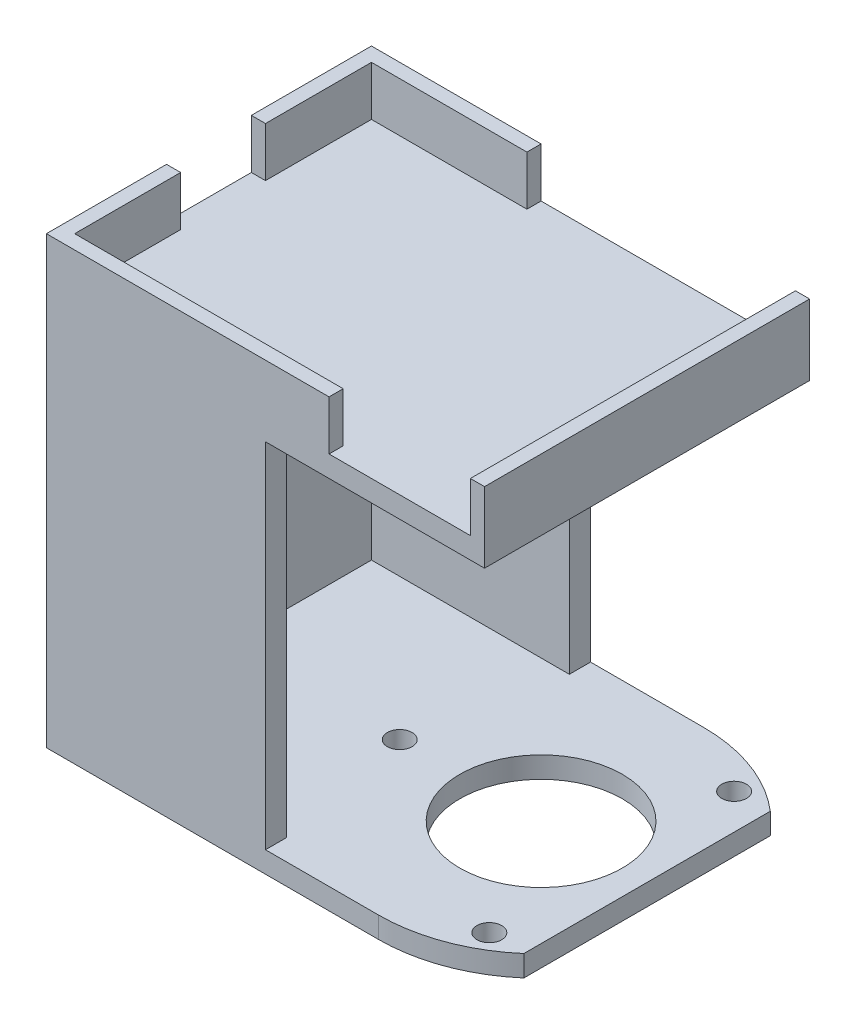
ISO-10303-21;
HEADER;
FILE_DESCRIPTION(('STEP AP214'),'2;1');
FILE_NAME('part.step','',(''),(''),'','','');
FILE_SCHEMA(('AUTOMOTIVE_DESIGN { 1 0 10303 214 1 1 1 1 }'));
ENDSEC;
DATA;
#1=APPLICATION_CONTEXT('core data for automotive mechanical design processes');
#2=APPLICATION_PROTOCOL_DEFINITION('international standard','automotive_design',2000,#1);
#3=PRODUCT_CONTEXT('',#1,'mechanical');
#4=PRODUCT('Part','Part','',(#3));
#5=PRODUCT_RELATED_PRODUCT_CATEGORY('part','',(#4));
#6=PRODUCT_DEFINITION_FORMATION('','',#4);
#7=PRODUCT_DEFINITION_CONTEXT('part definition',#1,'design');
#8=PRODUCT_DEFINITION('design','',#6,#7);
#9=PRODUCT_DEFINITION_SHAPE('','',#8);
#10=(LENGTH_UNIT() NAMED_UNIT(*) SI_UNIT(.MILLI.,.METRE.));
#11=(NAMED_UNIT(*) PLANE_ANGLE_UNIT() SI_UNIT($,.RADIAN.));
#12=(NAMED_UNIT(*) SI_UNIT($,.STERADIAN.) SOLID_ANGLE_UNIT());
#13=UNCERTAINTY_MEASURE_WITH_UNIT(LENGTH_MEASURE(1.E-05),#10,'distance_accuracy_value','');
#14=(GEOMETRIC_REPRESENTATION_CONTEXT(3) GLOBAL_UNCERTAINTY_ASSIGNED_CONTEXT((#13)) GLOBAL_UNIT_ASSIGNED_CONTEXT((#10,
#11,#12)) REPRESENTATION_CONTEXT('',''));
#15=CARTESIAN_POINT('',(0.,0.,0.));
#16=DIRECTION('',(0.,0.,1.));
#17=DIRECTION('',(1.,0.,0.));
#18=AXIS2_PLACEMENT_3D('',#15,#16,#17);
#19=CARTESIAN_POINT('',(-31.,10.,23.));
#20=DIRECTION('',(0.,0.,-1.));
#21=DIRECTION('',(-1.,0.,0.));
#22=AXIS2_PLACEMENT_3D('',#19,#20,#21);
#23=PLANE('',#22);
#24=DIRECTION('',(0.,-1.,0.));
#25=VECTOR('',#24,1.);
#26=CARTESIAN_POINT('',(16.,10.001,23.));
#27=LINE('',#26,#25);
#28=CARTESIAN_POINT('',(16.,-50.,23.));
#29=VERTEX_POINT('',#28);
#30=CARTESIAN_POINT('',(16.,-53.,23.));
#31=VERTEX_POINT('',#30);
#32=EDGE_CURVE('E506',#29,#31,#27,.T.);
#33=ORIENTED_EDGE('',*,*,#32,.F.);
#34=DIRECTION('',(-1.,0.,0.));
#35=VECTOR('',#34,1.);
#36=CARTESIAN_POINT('',(31.,-50.,23.));
#37=LINE('',#36,#35);
#38=CARTESIAN_POINT('',(0.,-50.,23.));
#39=VERTEX_POINT('',#38);
#40=EDGE_CURVE('E269',#29,#39,#37,.T.);
#41=ORIENTED_EDGE('',*,*,#40,.T.);
#42=DIRECTION('',(0.,1.,0.));
#43=VECTOR('',#42,1.);
#44=CARTESIAN_POINT('',(0.,-50.,23.));
#45=LINE('',#44,#43);
#46=CARTESIAN_POINT('',(0.,0.,23.));
#47=VERTEX_POINT('',#46);
#48=EDGE_CURVE('E330',#39,#47,#45,.T.);
#49=ORIENTED_EDGE('',*,*,#48,.T.);
#50=DIRECTION('',(1.,0.,0.));
#51=VECTOR('',#50,1.);
#52=CARTESIAN_POINT('',(-31.,0.,23.));
#53=LINE('',#52,#51);
#54=CARTESIAN_POINT('',(31.,0.,23.));
#55=VERTEX_POINT('',#54);
#56=EDGE_CURVE('E451',#47,#55,#53,.T.);
#57=ORIENTED_EDGE('',*,*,#56,.T.);
#58=DIRECTION('',(0.,-1.,0.));
#59=VECTOR('',#58,1.);
#60=CARTESIAN_POINT('',(31.,10.,23.));
#61=LINE('',#60,#59);
#62=CARTESIAN_POINT('',(31.,10.,23.));
#63=VERTEX_POINT('',#62);
#64=EDGE_CURVE('E466',#63,#55,#61,.T.);
#65=ORIENTED_EDGE('',*,*,#64,.F.);
#66=DIRECTION('',(1.,0.,0.));
#67=VECTOR('',#66,1.);
#68=CARTESIAN_POINT('',(-31.,10.,23.));
#69=LINE('',#68,#67);
#70=CARTESIAN_POINT('',(29.,10.,23.));
#71=VERTEX_POINT('',#70);
#72=EDGE_CURVE('E461',#71,#63,#69,.T.);
#73=ORIENTED_EDGE('',*,*,#72,.F.);
#74=DIRECTION('',(0.,1.,0.));
#75=VECTOR('',#74,1.);
#76=CARTESIAN_POINT('',(29.,10.,23.));
#77=LINE('',#76,#75);
#78=CARTESIAN_POINT('',(29.,3.,23.));
#79=VERTEX_POINT('',#78);
#80=EDGE_CURVE('E337',#79,#71,#77,.T.);
#81=ORIENTED_EDGE('',*,*,#80,.F.);
#82=DIRECTION('',(1.,0.,0.));
#83=VECTOR('',#82,1.);
#84=CARTESIAN_POINT('',(29.,3.,23.));
#85=LINE('',#84,#83);
#86=CARTESIAN_POINT('',(9.00000000000001,3.,23.));
#87=VERTEX_POINT('',#86);
#88=EDGE_CURVE('E349',#87,#79,#85,.T.);
#89=ORIENTED_EDGE('',*,*,#88,.F.);
#90=DIRECTION('',(0.,-1.,0.));
#91=VECTOR('',#90,1.);
#92=CARTESIAN_POINT('',(9.00000000000001,10.,23.));
#93=LINE('',#92,#91);
#94=CARTESIAN_POINT('',(9.00000000000001,10.,23.));
#95=VERTEX_POINT('',#94);
#96=EDGE_CURVE('E333',#95,#87,#93,.T.);
#97=ORIENTED_EDGE('',*,*,#96,.F.);
#98=CARTESIAN_POINT('',(-31.,10.,23.));
#99=VERTEX_POINT('',#98);
#100=EDGE_CURVE('E462',#99,#95,#69,.T.);
#101=ORIENTED_EDGE('',*,*,#100,.F.);
#102=DIRECTION('',(0.,-1.,0.));
#103=VECTOR('',#102,1.);
#104=CARTESIAN_POINT('',(-31.,10.,23.));
#105=LINE('',#104,#103);
#106=CARTESIAN_POINT('',(-31.,-53.,23.));
#107=VERTEX_POINT('',#106);
#108=EDGE_CURVE('E479',#99,#107,#105,.T.);
#109=ORIENTED_EDGE('',*,*,#108,.T.);
#110=DIRECTION('',(-1.,0.,0.));
#111=VECTOR('',#110,1.);
#112=CARTESIAN_POINT('',(31.,-53.,23.));
#113=LINE('',#112,#111);
#114=EDGE_CURVE('E266',#31,#107,#113,.T.);
#115=ORIENTED_EDGE('',*,*,#114,.F.);
#116=EDGE_LOOP('',(#33,#41,#49,#57,#65,#73,#81,#89,#97,#101,#109,#115));
#117=FACE_BOUND('',#116,.T.);
#118=ADVANCED_FACE('F63',(#117),#23,.F.);
#119=CARTESIAN_POINT('',(31.,-53.,-23.));
#120=DIRECTION('',(-1.,0.,0.));
#121=DIRECTION('',(0.,0.,1.));
#122=AXIS2_PLACEMENT_3D('',#119,#120,#121);
#123=PLANE('',#122);
#124=DIRECTION('',(0.,-1.,0.));
#125=VECTOR('',#124,1.);
#126=CARTESIAN_POINT('',(31.,10.001,-17.4355957741627));
#127=LINE('',#126,#125);
#128=CARTESIAN_POINT('',(31.,-50.,-17.4355957741627));
#129=VERTEX_POINT('',#128);
#130=CARTESIAN_POINT('',(31.,-53.,-17.4355957741627));
#131=VERTEX_POINT('',#130);
#132=EDGE_CURVE('E238',#129,#131,#127,.T.);
#133=ORIENTED_EDGE('',*,*,#132,.F.);
#134=DIRECTION('',(0.,0.,1.));
#135=VECTOR('',#134,1.);
#136=CARTESIAN_POINT('',(31.,-50.,-23.));
#137=LINE('',#136,#135);
#138=CARTESIAN_POINT('',(31.,-50.,17.4355957741627));
#139=VERTEX_POINT('',#138);
#140=EDGE_CURVE('E278',#129,#139,#137,.T.);
#141=ORIENTED_EDGE('',*,*,#140,.T.);
#142=DIRECTION('',(0.,-1.,0.));
#143=VECTOR('',#142,1.);
#144=CARTESIAN_POINT('',(31.,10.001,17.4355957741627));
#145=LINE('',#144,#143);
#146=CARTESIAN_POINT('',(31.,-53.,17.4355957741627));
#147=VERTEX_POINT('',#146);
#148=EDGE_CURVE('E87',#139,#147,#145,.T.);
#149=ORIENTED_EDGE('',*,*,#148,.T.);
#150=DIRECTION('',(0.,0.,1.));
#151=VECTOR('',#150,1.);
#152=CARTESIAN_POINT('',(31.,-53.,-23.));
#153=LINE('',#152,#151);
#154=EDGE_CURVE('E261',#131,#147,#153,.T.);
#155=ORIENTED_EDGE('',*,*,#154,.F.);
#156=EDGE_LOOP('',(#133,#141,#149,#155));
#157=FACE_BOUND('',#156,.T.);
#158=ADVANCED_FACE('F541',(#157),#123,.F.);
#159=CARTESIAN_POINT('',(0.,-53.,0.));
#160=DIRECTION('',(0.,-1.,0.));
#161=DIRECTION('',(0.,0.,-1.));
#162=AXIS2_PLACEMENT_3D('',#159,#160,#161);
#163=PLANE('',#162);
#164=CARTESIAN_POINT('',(-3.99999999999997,-53.,0.));
#165=DIRECTION('',(0.,-1.,0.));
#166=DIRECTION('',(0.,0.,-1.));
#167=AXIS2_PLACEMENT_3D('',#164,#165,#166);
#168=CIRCLE('',#167,1.75);
#169=CARTESIAN_POINT('',(-3.99999999999997,-53.,-1.75));
#170=VERTEX_POINT('',#169);
#171=EDGE_CURVE('E525',#170,#170,#168,.T.);
#172=ORIENTED_EDGE('',*,*,#171,.F.);
#173=EDGE_LOOP('',(#172));
#174=FACE_BOUND('',#173,.T.);
#175=CARTESIAN_POINT('',(16.,-53.,0.));
#176=DIRECTION('',(0.,-1.,0.));
#177=DIRECTION('',(0.,0.,-1.));
#178=AXIS2_PLACEMENT_3D('',#175,#176,#177);
#179=CIRCLE('',#178,11.5);
#180=CARTESIAN_POINT('',(16.,-53.,-11.5));
#181=VERTEX_POINT('',#180);
#182=EDGE_CURVE('E517',#181,#181,#179,.T.);
#183=ORIENTED_EDGE('',*,*,#182,.F.);
#184=EDGE_LOOP('',(#183));
#185=FACE_BOUND('',#184,.T.);
#186=CARTESIAN_POINT('',(26.,-53.,17.3205080756888));
#187=DIRECTION('',(0.,-1.,0.));
#188=DIRECTION('',(0.,0.,-1.));
#189=AXIS2_PLACEMENT_3D('',#186,#187,#188);
#190=CIRCLE('',#189,1.75);
#191=CARTESIAN_POINT('',(26.,-53.,15.5705080756888));
#192=VERTEX_POINT('',#191);
#193=EDGE_CURVE('E508',#192,#192,#190,.T.);
#194=ORIENTED_EDGE('',*,*,#193,.F.);
#195=EDGE_LOOP('',(#194));
#196=FACE_BOUND('',#195,.T.);
#197=CARTESIAN_POINT('',(26.,-53.,-17.3205080756888));
#198=DIRECTION('',(0.,-1.,0.));
#199=DIRECTION('',(0.,0.,-1.));
#200=AXIS2_PLACEMENT_3D('',#197,#198,#199);
#201=CIRCLE('',#200,1.75);
#202=CARTESIAN_POINT('',(26.,-53.,-19.0705080756888));
#203=VERTEX_POINT('',#202);
#204=EDGE_CURVE('E501',#203,#203,#201,.T.);
#205=ORIENTED_EDGE('',*,*,#204,.F.);
#206=EDGE_LOOP('',(#205));
#207=FACE_BOUND('',#206,.T.);
#208=DIRECTION('',(1.,0.,0.));
#209=VECTOR('',#208,1.);
#210=CARTESIAN_POINT('',(31.,-53.,-23.));
#211=LINE('',#210,#209);
#212=CARTESIAN_POINT('',(-31.,-53.,-23.));
#213=VERTEX_POINT('',#212);
#214=CARTESIAN_POINT('',(16.,-53.,-23.));
#215=VERTEX_POINT('',#214);
#216=EDGE_CURVE('E251',#213,#215,#211,.T.);
#217=ORIENTED_EDGE('',*,*,#216,.T.);
#218=CARTESIAN_POINT('',(16.,-53.,0.));
#219=DIRECTION('',(0.,-1.,0.));
#220=DIRECTION('',(0.,0.,-1.));
#221=AXIS2_PLACEMENT_3D('',#218,#219,#220);
#222=CIRCLE('',#221,23.);
#223=EDGE_CURVE('E235',#215,#131,#222,.T.);
#224=ORIENTED_EDGE('',*,*,#223,.T.);
#225=ORIENTED_EDGE('',*,*,#154,.T.);
#226=CARTESIAN_POINT('',(16.,-53.,0.));
#227=DIRECTION('',(0.,-1.,0.));
#228=DIRECTION('',(0.,0.,-1.));
#229=AXIS2_PLACEMENT_3D('',#226,#227,#228);
#230=CIRCLE('',#229,23.);
#231=EDGE_CURVE('E279',#147,#31,#230,.T.);
#232=ORIENTED_EDGE('',*,*,#231,.T.);
#233=ORIENTED_EDGE('',*,*,#114,.T.);
#234=DIRECTION('',(0.,0.,-1.));
#235=VECTOR('',#234,1.);
#236=CARTESIAN_POINT('',(-31.,-53.,-23.));
#237=LINE('',#236,#235);
#238=EDGE_CURVE('E259',#107,#213,#237,.T.);
#239=ORIENTED_EDGE('',*,*,#238,.T.);
#240=EDGE_LOOP('',(#217,#224,#225,#232,#233,#239));
#241=FACE_BOUND('',#240,.T.);
#242=ADVANCED_FACE('F257',(#174,#185,#196,#207,#241),#163,.T.);
#243=CARTESIAN_POINT('',(0.,-50.,0.));
#244=DIRECTION('',(0.,-1.,0.));
#245=DIRECTION('',(0.,0.,-1.));
#246=AXIS2_PLACEMENT_3D('',#243,#244,#245);
#247=PLANE('',#246);
#248=CARTESIAN_POINT('',(-3.99999999999997,-50.,0.));
#249=DIRECTION('',(0.,-1.,0.));
#250=DIRECTION('',(0.,0.,-1.));
#251=AXIS2_PLACEMENT_3D('',#248,#249,#250);
#252=CIRCLE('',#251,1.75);
#253=CARTESIAN_POINT('',(-3.99999999999997,-50.,-1.75));
#254=VERTEX_POINT('',#253);
#255=EDGE_CURVE('E521',#254,#254,#252,.F.);
#256=ORIENTED_EDGE('',*,*,#255,.F.);
#257=EDGE_LOOP('',(#256));
#258=FACE_BOUND('',#257,.T.);
#259=CARTESIAN_POINT('',(16.,-50.,0.));
#260=DIRECTION('',(0.,-1.,0.));
#261=DIRECTION('',(0.,0.,-1.));
#262=AXIS2_PLACEMENT_3D('',#259,#260,#261);
#263=CIRCLE('',#262,11.5);
#264=CARTESIAN_POINT('',(16.,-50.,-11.5));
#265=VERTEX_POINT('',#264);
#266=EDGE_CURVE('E513',#265,#265,#263,.F.);
#267=ORIENTED_EDGE('',*,*,#266,.F.);
#268=EDGE_LOOP('',(#267));
#269=FACE_BOUND('',#268,.T.);
#270=CARTESIAN_POINT('',(26.,-50.,17.3205080756888));
#271=DIRECTION('',(0.,-1.,0.));
#272=DIRECTION('',(0.,0.,-1.));
#273=AXIS2_PLACEMENT_3D('',#270,#271,#272);
#274=CIRCLE('',#273,1.75);
#275=CARTESIAN_POINT('',(26.,-50.,15.5705080756888));
#276=VERTEX_POINT('',#275);
#277=EDGE_CURVE('E512',#276,#276,#274,.F.);
#278=ORIENTED_EDGE('',*,*,#277,.F.);
#279=EDGE_LOOP('',(#278));
#280=FACE_BOUND('',#279,.T.);
#281=CARTESIAN_POINT('',(26.,-50.,-17.3205080756888));
#282=DIRECTION('',(0.,-1.,0.));
#283=DIRECTION('',(0.,0.,-1.));
#284=AXIS2_PLACEMENT_3D('',#281,#282,#283);
#285=CIRCLE('',#284,1.75);
#286=CARTESIAN_POINT('',(26.,-50.,-19.0705080756888));
#287=VERTEX_POINT('',#286);
#288=EDGE_CURVE('E495',#287,#287,#285,.F.);
#289=ORIENTED_EDGE('',*,*,#288,.F.);
#290=EDGE_LOOP('',(#289));
#291=FACE_BOUND('',#290,.T.);
#292=CARTESIAN_POINT('',(16.,-50.,0.));
#293=DIRECTION('',(0.,-1.,0.));
#294=DIRECTION('',(0.,0.,-1.));
#295=AXIS2_PLACEMENT_3D('',#292,#293,#294);
#296=CIRCLE('',#295,23.);
#297=CARTESIAN_POINT('',(16.,-50.,-23.));
#298=VERTEX_POINT('',#297);
#299=EDGE_CURVE('E244',#129,#298,#296,.F.);
#300=ORIENTED_EDGE('',*,*,#299,.T.);
#301=DIRECTION('',(1.,0.,0.));
#302=VECTOR('',#301,1.);
#303=CARTESIAN_POINT('',(31.,-50.,-23.));
#304=LINE('',#303,#302);
#305=CARTESIAN_POINT('',(0.,-50.,-23.));
#306=VERTEX_POINT('',#305);
#307=EDGE_CURVE('E254',#306,#298,#304,.T.);
#308=ORIENTED_EDGE('',*,*,#307,.F.);
#309=DIRECTION('',(0.,0.,-1.));
#310=VECTOR('',#309,1.);
#311=CARTESIAN_POINT('',(0.,-50.,0.));
#312=LINE('',#311,#310);
#313=CARTESIAN_POINT('',(0.,-50.,-20.));
#314=VERTEX_POINT('',#313);
#315=EDGE_CURVE('E289',#314,#306,#312,.T.);
#316=ORIENTED_EDGE('',*,*,#315,.F.);
#317=DIRECTION('',(-1.,0.,0.));
#318=VECTOR('',#317,1.);
#319=CARTESIAN_POINT('',(0.,-50.,-20.));
#320=LINE('',#319,#318);
#321=CARTESIAN_POINT('',(-28.,-50.,-20.));
#322=VERTEX_POINT('',#321);
#323=EDGE_CURVE('E291',#314,#322,#320,.T.);
#324=ORIENTED_EDGE('',*,*,#323,.T.);
#325=DIRECTION('',(0.,0.,1.));
#326=VECTOR('',#325,1.);
#327=CARTESIAN_POINT('',(-28.,-50.,0.));
#328=LINE('',#327,#326);
#329=CARTESIAN_POINT('',(-28.,-50.,20.));
#330=VERTEX_POINT('',#329);
#331=EDGE_CURVE('E294',#322,#330,#328,.T.);
#332=ORIENTED_EDGE('',*,*,#331,.T.);
#333=DIRECTION('',(-1.,0.,0.));
#334=VECTOR('',#333,1.);
#335=CARTESIAN_POINT('',(0.,-50.,20.));
#336=LINE('',#335,#334);
#337=CARTESIAN_POINT('',(0.,-50.,20.));
#338=VERTEX_POINT('',#337);
#339=EDGE_CURVE('E297',#338,#330,#336,.T.);
#340=ORIENTED_EDGE('',*,*,#339,.F.);
#341=EDGE_CURVE('E285',#39,#338,#312,.T.);
#342=ORIENTED_EDGE('',*,*,#341,.F.);
#343=ORIENTED_EDGE('',*,*,#40,.F.);
#344=CARTESIAN_POINT('',(16.,-50.,0.));
#345=DIRECTION('',(0.,-1.,0.));
#346=DIRECTION('',(0.,0.,-1.));
#347=AXIS2_PLACEMENT_3D('',#344,#345,#346);
#348=CIRCLE('',#347,23.);
#349=EDGE_CURVE('E535',#29,#139,#348,.F.);
#350=ORIENTED_EDGE('',*,*,#349,.T.);
#351=ORIENTED_EDGE('',*,*,#140,.F.);
#352=EDGE_LOOP('',(#300,#308,#316,#324,#332,#340,#342,#343,#350,#351));
#353=FACE_BOUND('',#352,.T.);
#354=ADVANCED_FACE('F561',(#258,#269,#280,#291,#353),#247,.F.);
#355=CARTESIAN_POINT('',(0.,10.,0.));
#356=DIRECTION('',(0.,1.,0.));
#357=DIRECTION('',(0.,0.,1.));
#358=AXIS2_PLACEMENT_3D('',#355,#356,#357);
#359=PLANE('',#358);
#360=DIRECTION('',(0.,0.,-1.));
#361=VECTOR('',#360,1.);
#362=CARTESIAN_POINT('',(29.,10.,-21.));
#363=LINE('',#362,#361);
#364=CARTESIAN_POINT('',(29.,10.,-23.));
#365=VERTEX_POINT('',#364);
#366=EDGE_CURVE('E407',#71,#365,#363,.T.);
#367=ORIENTED_EDGE('',*,*,#366,.F.);
#368=ORIENTED_EDGE('',*,*,#72,.T.);
#369=DIRECTION('',(0.,0.,-1.));
#370=VECTOR('',#369,1.);
#371=CARTESIAN_POINT('',(31.,10.,-23.));
#372=LINE('',#371,#370);
#373=CARTESIAN_POINT('',(31.,10.,-23.));
#374=VERTEX_POINT('',#373);
#375=EDGE_CURVE('E446',#63,#374,#372,.T.);
#376=ORIENTED_EDGE('',*,*,#375,.T.);
#377=DIRECTION('',(-1.,0.,0.));
#378=VECTOR('',#377,1.);
#379=CARTESIAN_POINT('',(-31.,10.,-23.));
#380=LINE('',#379,#378);
#381=EDGE_CURVE('E452',#374,#365,#380,.T.);
#382=ORIENTED_EDGE('',*,*,#381,.T.);
#383=EDGE_LOOP('',(#367,#368,#376,#382));
#384=FACE_BOUND('',#383,.T.);
#385=ADVANCED_FACE('F577',(#384),#359,.T.);
#386=DIRECTION('',(0.,0.,-1.));
#387=VECTOR('',#386,1.);
#388=CARTESIAN_POINT('',(9.00000000000001,10.,23.001));
#389=LINE('',#388,#387);
#390=CARTESIAN_POINT('',(9.00000000000001,10.,21.));
#391=VERTEX_POINT('',#390);
#392=EDGE_CURVE('E345',#95,#391,#389,.T.);
#393=ORIENTED_EDGE('',*,*,#392,.T.);
#394=DIRECTION('',(1.,0.,0.));
#395=VECTOR('',#394,1.);
#396=CARTESIAN_POINT('',(-29.,10.,21.));
#397=LINE('',#396,#395);
#398=CARTESIAN_POINT('',(-29.,10.,21.));
#399=VERTEX_POINT('',#398);
#400=EDGE_CURVE('E412',#399,#391,#397,.T.);
#401=ORIENTED_EDGE('',*,*,#400,.F.);
#402=DIRECTION('',(0.,0.,1.));
#403=VECTOR('',#402,1.);
#404=CARTESIAN_POINT('',(-29.,10.,-21.));
#405=LINE('',#404,#403);
#406=CARTESIAN_POINT('',(-29.,10.,6.00000000000001));
#407=VERTEX_POINT('',#406);
#408=EDGE_CURVE('E430',#407,#399,#405,.T.);
#409=ORIENTED_EDGE('',*,*,#408,.F.);
#410=DIRECTION('',(-1.,0.,0.));
#411=VECTOR('',#410,1.);
#412=CARTESIAN_POINT('',(31.001,10.,5.99999999999999));
#413=LINE('',#412,#411);
#414=CARTESIAN_POINT('',(-31.,10.,6.00000000000001));
#415=VERTEX_POINT('',#414);
#416=EDGE_CURVE('E380',#407,#415,#413,.T.);
#417=ORIENTED_EDGE('',*,*,#416,.T.);
#418=DIRECTION('',(0.,0.,1.));
#419=VECTOR('',#418,1.);
#420=CARTESIAN_POINT('',(-31.,10.,-23.));
#421=LINE('',#420,#419);
#422=EDGE_CURVE('E456',#415,#99,#421,.T.);
#423=ORIENTED_EDGE('',*,*,#422,.T.);
#424=ORIENTED_EDGE('',*,*,#100,.T.);
#425=EDGE_LOOP('',(#393,#401,#409,#417,#423,#424));
#426=FACE_BOUND('',#425,.T.);
#427=ADVANCED_FACE('F587',(#426),#359,.T.);
#428=CARTESIAN_POINT('',(-29.,3.,-21.));
#429=DIRECTION('',(-1.,0.,0.));
#430=DIRECTION('',(0.,0.,1.));
#431=AXIS2_PLACEMENT_3D('',#428,#429,#430);
#432=PLANE('',#431);
#433=CARTESIAN_POINT('',(-29.,10.,-21.));
#434=VERTEX_POINT('',#433);
#435=CARTESIAN_POINT('',(-29.,10.,-5.99999999999999));
#436=VERTEX_POINT('',#435);
#437=EDGE_CURVE('E431',#434,#436,#405,.T.);
#438=ORIENTED_EDGE('',*,*,#437,.T.);
#439=DIRECTION('',(0.,1.,0.));
#440=VECTOR('',#439,1.);
#441=CARTESIAN_POINT('',(-29.,17.,-5.99999999999999));
#442=LINE('',#441,#440);
#443=CARTESIAN_POINT('',(-29.,3.,-5.99999999999999));
#444=VERTEX_POINT('',#443);
#445=EDGE_CURVE('E402',#444,#436,#442,.T.);
#446=ORIENTED_EDGE('',*,*,#445,.F.);
#447=DIRECTION('',(0.,0.,1.));
#448=VECTOR('',#447,1.);
#449=CARTESIAN_POINT('',(-29.,3.,-21.));
#450=LINE('',#449,#448);
#451=CARTESIAN_POINT('',(-29.,3.,-21.));
#452=VERTEX_POINT('',#451);
#453=EDGE_CURVE('E416',#452,#444,#450,.T.);
#454=ORIENTED_EDGE('',*,*,#453,.F.);
#455=DIRECTION('',(0.,1.,0.));
#456=VECTOR('',#455,1.);
#457=CARTESIAN_POINT('',(-29.,3.,-21.));
#458=LINE('',#457,#456);
#459=EDGE_CURVE('E424',#452,#434,#458,.T.);
#460=ORIENTED_EDGE('',*,*,#459,.T.);
#461=EDGE_LOOP('',(#438,#446,#454,#460));
#462=FACE_BOUND('',#461,.T.);
#463=ADVANCED_FACE('F582',(#462),#432,.F.);
#464=CARTESIAN_POINT('',(31.,10.,-23.));
#465=DIRECTION('',(-1.,0.,0.));
#466=DIRECTION('',(0.,0.,1.));
#467=AXIS2_PLACEMENT_3D('',#464,#465,#466);
#468=PLANE('',#467);
#469=DIRECTION('',(0.,0.,-1.));
#470=VECTOR('',#469,1.);
#471=CARTESIAN_POINT('',(31.,0.,-23.));
#472=LINE('',#471,#470);
#473=CARTESIAN_POINT('',(31.,0.,-23.));
#474=VERTEX_POINT('',#473);
#475=EDGE_CURVE('E442',#55,#474,#472,.T.);
#476=ORIENTED_EDGE('',*,*,#475,.T.);
#477=DIRECTION('',(0.,-1.,0.));
#478=VECTOR('',#477,1.);
#479=CARTESIAN_POINT('',(31.,10.,-23.));
#480=LINE('',#479,#478);
#481=EDGE_CURVE('E12',#374,#474,#480,.T.);
#482=ORIENTED_EDGE('',*,*,#481,.F.);
#483=ORIENTED_EDGE('',*,*,#375,.F.);
#484=ORIENTED_EDGE('',*,*,#64,.T.);
#485=EDGE_LOOP('',(#476,#482,#483,#484));
#486=FACE_BOUND('',#485,.T.);
#487=ADVANCED_FACE('F65',(#486),#468,.F.);
#488=CARTESIAN_POINT('',(-31.,10.,-23.));
#489=DIRECTION('',(0.,0.,1.));
#490=DIRECTION('',(1.,0.,0.));
#491=AXIS2_PLACEMENT_3D('',#488,#489,#490);
#492=PLANE('',#491);
#493=ORIENTED_EDGE('',*,*,#307,.T.);
#494=DIRECTION('',(0.,-1.,0.));
#495=VECTOR('',#494,1.);
#496=CARTESIAN_POINT('',(16.,10.001,-23.));
#497=LINE('',#496,#495);
#498=EDGE_CURVE('E79',#298,#215,#497,.T.);
#499=ORIENTED_EDGE('',*,*,#498,.T.);
#500=ORIENTED_EDGE('',*,*,#216,.F.);
#501=DIRECTION('',(0.,-1.,0.));
#502=VECTOR('',#501,1.);
#503=CARTESIAN_POINT('',(-31.,10.,-23.));
#504=LINE('',#503,#502);
#505=CARTESIAN_POINT('',(-31.,10.,-23.));
#506=VERTEX_POINT('',#505);
#507=EDGE_CURVE('E72',#506,#213,#504,.T.);
#508=ORIENTED_EDGE('',*,*,#507,.F.);
#509=CARTESIAN_POINT('',(-7.,9.99999999999999,-23.));
#510=VERTEX_POINT('',#509);
#511=EDGE_CURVE('E450',#510,#506,#380,.T.);
#512=ORIENTED_EDGE('',*,*,#511,.F.);
#513=DIRECTION('',(0.,1.,0.));
#514=VECTOR('',#513,1.);
#515=CARTESIAN_POINT('',(-7.,9.99999999999999,-23.));
#516=LINE('',#515,#514);
#517=CARTESIAN_POINT('',(-7.,3.,-23.));
#518=VERTEX_POINT('',#517);
#519=EDGE_CURVE('E355',#518,#510,#516,.T.);
#520=ORIENTED_EDGE('',*,*,#519,.F.);
#521=DIRECTION('',(-1.,0.,0.));
#522=VECTOR('',#521,1.);
#523=CARTESIAN_POINT('',(29.,3.,-23.));
#524=LINE('',#523,#522);
#525=CARTESIAN_POINT('',(29.,3.,-23.));
#526=VERTEX_POINT('',#525);
#527=EDGE_CURVE('E358',#526,#518,#524,.T.);
#528=ORIENTED_EDGE('',*,*,#527,.F.);
#529=DIRECTION('',(0.,-1.,0.));
#530=VECTOR('',#529,1.);
#531=CARTESIAN_POINT('',(29.,10.,-23.));
#532=LINE('',#531,#530);
#533=EDGE_CURVE('E362',#365,#526,#532,.T.);
#534=ORIENTED_EDGE('',*,*,#533,.F.);
#535=ORIENTED_EDGE('',*,*,#381,.F.);
#536=ORIENTED_EDGE('',*,*,#481,.T.);
#537=DIRECTION('',(-1.,0.,0.));
#538=VECTOR('',#537,1.);
#539=CARTESIAN_POINT('',(-31.,0.,-23.));
#540=LINE('',#539,#538);
#541=CARTESIAN_POINT('',(0.,0.,-23.));
#542=VERTEX_POINT('',#541);
#543=EDGE_CURVE('E470',#474,#542,#540,.T.);
#544=ORIENTED_EDGE('',*,*,#543,.T.);
#545=DIRECTION('',(0.,1.,0.));
#546=VECTOR('',#545,1.);
#547=CARTESIAN_POINT('',(0.,-50.,-23.));
#548=LINE('',#547,#546);
#549=EDGE_CURVE('E327',#306,#542,#548,.T.);
#550=ORIENTED_EDGE('',*,*,#549,.F.);
#551=EDGE_LOOP('',(#493,#499,#500,#508,#512,#520,#528,#534,#535,#536,#544,#550));
#552=FACE_BOUND('',#551,.T.);
#553=ADVANCED_FACE('F249',(#552),#492,.F.);
#554=CARTESIAN_POINT('',(-31.,10.,-23.));
#555=DIRECTION('',(1.,0.,0.));
#556=DIRECTION('',(0.,0.,-1.));
#557=AXIS2_PLACEMENT_3D('',#554,#555,#556);
#558=PLANE('',#557);
#559=DIRECTION('',(0.,0.,1.));
#560=VECTOR('',#559,1.);
#561=CARTESIAN_POINT('',(-31.,3.,-5.99999999999999));
#562=LINE('',#561,#560);
#563=CARTESIAN_POINT('',(-31.,3.,-5.99999999999999));
#564=VERTEX_POINT('',#563);
#565=CARTESIAN_POINT('',(-31.,3.,6.00000000000001));
#566=VERTEX_POINT('',#565);
#567=EDGE_CURVE('E391',#564,#566,#562,.T.);
#568=ORIENTED_EDGE('',*,*,#567,.F.);
#569=DIRECTION('',(0.,-1.,0.));
#570=VECTOR('',#569,1.);
#571=CARTESIAN_POINT('',(-31.,17.,-5.99999999999999));
#572=LINE('',#571,#570);
#573=CARTESIAN_POINT('',(-31.,10.,-5.99999999999999));
#574=VERTEX_POINT('',#573);
#575=EDGE_CURVE('E387',#574,#564,#572,.T.);
#576=ORIENTED_EDGE('',*,*,#575,.F.);
#577=EDGE_CURVE('E457',#506,#574,#421,.T.);
#578=ORIENTED_EDGE('',*,*,#577,.F.);
#579=ORIENTED_EDGE('',*,*,#507,.T.);
#580=ORIENTED_EDGE('',*,*,#238,.F.);
#581=ORIENTED_EDGE('',*,*,#108,.F.);
#582=ORIENTED_EDGE('',*,*,#422,.F.);
#583=DIRECTION('',(0.,1.,0.));
#584=VECTOR('',#583,1.);
#585=CARTESIAN_POINT('',(-31.,17.,6.00000000000001));
#586=LINE('',#585,#584);
#587=EDGE_CURVE('E395',#566,#415,#586,.T.);
#588=ORIENTED_EDGE('',*,*,#587,.F.);
#589=EDGE_LOOP('',(#568,#576,#578,#579,#580,#581,#582,#588));
#590=FACE_BOUND('',#589,.T.);
#591=ADVANCED_FACE('F486',(#590),#558,.F.);
#592=DIRECTION('',(0.,0.,1.));
#593=VECTOR('',#592,1.);
#594=CARTESIAN_POINT('',(-7.,9.99999999999999,-23.001));
#595=LINE('',#594,#593);
#596=CARTESIAN_POINT('',(-7.,9.99999999999999,-21.));
#597=VERTEX_POINT('',#596);
#598=EDGE_CURVE('E369',#510,#597,#595,.T.);
#599=ORIENTED_EDGE('',*,*,#598,.F.);
#600=ORIENTED_EDGE('',*,*,#511,.T.);
#601=ORIENTED_EDGE('',*,*,#577,.T.);
#602=DIRECTION('',(1.,0.,0.));
#603=VECTOR('',#602,1.);
#604=CARTESIAN_POINT('',(31.001,10.,-6.00000000000001));
#605=LINE('',#604,#603);
#606=EDGE_CURVE('E374',#574,#436,#605,.T.);
#607=ORIENTED_EDGE('',*,*,#606,.T.);
#608=ORIENTED_EDGE('',*,*,#437,.F.);
#609=DIRECTION('',(-1.,0.,0.));
#610=VECTOR('',#609,1.);
#611=CARTESIAN_POINT('',(-29.,10.,-21.));
#612=LINE('',#611,#610);
#613=EDGE_CURVE('E427',#597,#434,#612,.T.);
#614=ORIENTED_EDGE('',*,*,#613,.F.);
#615=EDGE_LOOP('',(#599,#600,#601,#607,#608,#614));
#616=FACE_BOUND('',#615,.T.);
#617=ADVANCED_FACE('F601',(#616),#359,.T.);
#618=CARTESIAN_POINT('',(0.,0.,0.));
#619=DIRECTION('',(0.,1.,0.));
#620=DIRECTION('',(0.,0.,1.));
#621=AXIS2_PLACEMENT_3D('',#618,#619,#620);
#622=PLANE('',#621);
#623=ORIENTED_EDGE('',*,*,#56,.F.);
#624=DIRECTION('',(0.,0.,-1.));
#625=VECTOR('',#624,1.);
#626=CARTESIAN_POINT('',(0.,0.,0.));
#627=LINE('',#626,#625);
#628=CARTESIAN_POINT('',(0.,0.,20.));
#629=VERTEX_POINT('',#628);
#630=EDGE_CURVE('E275',#47,#629,#627,.T.);
#631=ORIENTED_EDGE('',*,*,#630,.T.);
#632=DIRECTION('',(-1.,0.,0.));
#633=VECTOR('',#632,1.);
#634=CARTESIAN_POINT('',(0.,0.,20.));
#635=LINE('',#634,#633);
#636=CARTESIAN_POINT('',(-28.,0.,20.));
#637=VERTEX_POINT('',#636);
#638=EDGE_CURVE('E290',#629,#637,#635,.T.);
#639=ORIENTED_EDGE('',*,*,#638,.T.);
#640=DIRECTION('',(0.,0.,1.));
#641=VECTOR('',#640,1.);
#642=CARTESIAN_POINT('',(-28.,0.,0.));
#643=LINE('',#642,#641);
#644=CARTESIAN_POINT('',(-28.,0.,-20.));
#645=VERTEX_POINT('',#644);
#646=EDGE_CURVE('E309',#645,#637,#643,.T.);
#647=ORIENTED_EDGE('',*,*,#646,.F.);
#648=DIRECTION('',(-1.,0.,0.));
#649=VECTOR('',#648,1.);
#650=CARTESIAN_POINT('',(0.,0.,-20.));
#651=LINE('',#650,#649);
#652=CARTESIAN_POINT('',(0.,0.,-20.));
#653=VERTEX_POINT('',#652);
#654=EDGE_CURVE('E306',#653,#645,#651,.T.);
#655=ORIENTED_EDGE('',*,*,#654,.F.);
#656=EDGE_CURVE('E305',#653,#542,#627,.T.);
#657=ORIENTED_EDGE('',*,*,#656,.T.);
#658=ORIENTED_EDGE('',*,*,#543,.F.);
#659=ORIENTED_EDGE('',*,*,#475,.F.);
#660=EDGE_LOOP('',(#623,#631,#639,#647,#655,#657,#658,#659));
#661=FACE_BOUND('',#660,.T.);
#662=ADVANCED_FACE('F567',(#661),#622,.F.);
#663=CARTESIAN_POINT('',(29.,3.,-21.));
#664=DIRECTION('',(1.,0.,0.));
#665=DIRECTION('',(0.,0.,-1.));
#666=AXIS2_PLACEMENT_3D('',#663,#664,#665);
#667=PLANE('',#666);
#668=ORIENTED_EDGE('',*,*,#366,.T.);
#669=ORIENTED_EDGE('',*,*,#533,.T.);
#670=DIRECTION('',(0.,0.,-1.));
#671=VECTOR('',#670,1.);
#672=CARTESIAN_POINT('',(29.,3.,-21.));
#673=LINE('',#672,#671);
#674=EDGE_CURVE('E408',#79,#526,#673,.T.);
#675=ORIENTED_EDGE('',*,*,#674,.F.);
#676=ORIENTED_EDGE('',*,*,#80,.T.);
#677=EDGE_LOOP('',(#668,#669,#675,#676));
#678=FACE_BOUND('',#677,.T.);
#679=ADVANCED_FACE('F608',(#678),#667,.F.);
#680=CARTESIAN_POINT('',(-29.,3.,21.));
#681=DIRECTION('',(0.,0.,1.));
#682=DIRECTION('',(1.,0.,0.));
#683=AXIS2_PLACEMENT_3D('',#680,#681,#682);
#684=PLANE('',#683);
#685=ORIENTED_EDGE('',*,*,#400,.T.);
#686=DIRECTION('',(0.,1.,0.));
#687=VECTOR('',#686,1.);
#688=CARTESIAN_POINT('',(9.00000000000001,10.,21.));
#689=LINE('',#688,#687);
#690=CARTESIAN_POINT('',(9.00000000000001,3.,21.));
#691=VERTEX_POINT('',#690);
#692=EDGE_CURVE('E341',#691,#391,#689,.T.);
#693=ORIENTED_EDGE('',*,*,#692,.F.);
#694=DIRECTION('',(1.,0.,0.));
#695=VECTOR('',#694,1.);
#696=CARTESIAN_POINT('',(-29.,3.,21.));
#697=LINE('',#696,#695);
#698=CARTESIAN_POINT('',(-29.,3.,21.));
#699=VERTEX_POINT('',#698);
#700=EDGE_CURVE('E420',#699,#691,#697,.T.);
#701=ORIENTED_EDGE('',*,*,#700,.F.);
#702=DIRECTION('',(0.,1.,0.));
#703=VECTOR('',#702,1.);
#704=CARTESIAN_POINT('',(-29.,3.,21.));
#705=LINE('',#704,#703);
#706=EDGE_CURVE('E438',#699,#399,#705,.T.);
#707=ORIENTED_EDGE('',*,*,#706,.T.);
#708=EDGE_LOOP('',(#685,#693,#701,#707));
#709=FACE_BOUND('',#708,.T.);
#710=ADVANCED_FACE('F619',(#709),#684,.F.);
#711=CARTESIAN_POINT('',(-29.,3.,5.99999999999999));
#712=VERTEX_POINT('',#711);
#713=EDGE_CURVE('E415',#712,#699,#450,.T.);
#714=ORIENTED_EDGE('',*,*,#713,.F.);
#715=DIRECTION('',(0.,-1.,0.));
#716=VECTOR('',#715,1.);
#717=CARTESIAN_POINT('',(-29.,17.,6.00000000000001));
#718=LINE('',#717,#716);
#719=EDGE_CURVE('E384',#407,#712,#718,.T.);
#720=ORIENTED_EDGE('',*,*,#719,.F.);
#721=ORIENTED_EDGE('',*,*,#408,.T.);
#722=ORIENTED_EDGE('',*,*,#706,.F.);
#723=EDGE_LOOP('',(#714,#720,#721,#722));
#724=FACE_BOUND('',#723,.T.);
#725=ADVANCED_FACE('F590',(#724),#432,.F.);
#726=CARTESIAN_POINT('',(-29.,3.,-21.));
#727=DIRECTION('',(0.,0.,-1.));
#728=DIRECTION('',(-1.,0.,0.));
#729=AXIS2_PLACEMENT_3D('',#726,#727,#728);
#730=PLANE('',#729);
#731=DIRECTION('',(-1.,0.,0.));
#732=VECTOR('',#731,1.);
#733=CARTESIAN_POINT('',(-29.,3.,-21.));
#734=LINE('',#733,#732);
#735=CARTESIAN_POINT('',(-7.00000000000001,3.,-21.));
#736=VERTEX_POINT('',#735);
#737=EDGE_CURVE('E411',#736,#452,#734,.T.);
#738=ORIENTED_EDGE('',*,*,#737,.F.);
#739=DIRECTION('',(0.,-1.,0.));
#740=VECTOR('',#739,1.);
#741=CARTESIAN_POINT('',(-7.,9.99999999999999,-21.));
#742=LINE('',#741,#740);
#743=EDGE_CURVE('E366',#597,#736,#742,.T.);
#744=ORIENTED_EDGE('',*,*,#743,.F.);
#745=ORIENTED_EDGE('',*,*,#613,.T.);
#746=ORIENTED_EDGE('',*,*,#459,.F.);
#747=EDGE_LOOP('',(#738,#744,#745,#746));
#748=FACE_BOUND('',#747,.T.);
#749=ADVANCED_FACE('F639',(#748),#730,.F.);
#750=CARTESIAN_POINT('',(0.,3.,0.));
#751=DIRECTION('',(0.,1.,0.));
#752=DIRECTION('',(0.,0.,1.));
#753=AXIS2_PLACEMENT_3D('',#750,#751,#752);
#754=PLANE('',#753);
#755=ORIENTED_EDGE('',*,*,#674,.T.);
#756=ORIENTED_EDGE('',*,*,#527,.T.);
#757=DIRECTION('',(0.,0.,1.));
#758=VECTOR('',#757,1.);
#759=CARTESIAN_POINT('',(-7.,3.,-23.001));
#760=LINE('',#759,#758);
#761=EDGE_CURVE('E370',#518,#736,#760,.T.);
#762=ORIENTED_EDGE('',*,*,#761,.T.);
#763=ORIENTED_EDGE('',*,*,#737,.T.);
#764=ORIENTED_EDGE('',*,*,#453,.T.);
#765=DIRECTION('',(-1.,0.,0.));
#766=VECTOR('',#765,1.);
#767=CARTESIAN_POINT('',(31.001,3.,-6.00000000000001));
#768=LINE('',#767,#766);
#769=EDGE_CURVE('E398',#444,#564,#768,.T.);
#770=ORIENTED_EDGE('',*,*,#769,.T.);
#771=ORIENTED_EDGE('',*,*,#567,.T.);
#772=DIRECTION('',(-1.,0.,0.));
#773=VECTOR('',#772,1.);
#774=CARTESIAN_POINT('',(31.001,3.,5.99999999999999));
#775=LINE('',#774,#773);
#776=EDGE_CURVE('E399',#712,#566,#775,.T.);
#777=ORIENTED_EDGE('',*,*,#776,.F.);
#778=ORIENTED_EDGE('',*,*,#713,.T.);
#779=ORIENTED_EDGE('',*,*,#700,.T.);
#780=DIRECTION('',(0.,0.,-1.));
#781=VECTOR('',#780,1.);
#782=CARTESIAN_POINT('',(9.00000000000001,3.,23.001));
#783=LINE('',#782,#781);
#784=EDGE_CURVE('E344',#87,#691,#783,.T.);
#785=ORIENTED_EDGE('',*,*,#784,.F.);
#786=ORIENTED_EDGE('',*,*,#88,.T.);
#787=EDGE_LOOP('',(#755,#756,#762,#763,#764,#770,#771,#777,#778,#779,#785,#786));
#788=FACE_BOUND('',#787,.T.);
#789=ADVANCED_FACE('F630',(#788),#754,.T.);
#790=CARTESIAN_POINT('',(31.001,17.,-6.00000000000001));
#791=DIRECTION('',(0.,0.,-1.));
#792=DIRECTION('',(-1.,0.,0.));
#793=AXIS2_PLACEMENT_3D('',#790,#791,#792);
#794=PLANE('',#793);
#795=ORIENTED_EDGE('',*,*,#575,.T.);
#796=ORIENTED_EDGE('',*,*,#769,.F.);
#797=ORIENTED_EDGE('',*,*,#445,.T.);
#798=ORIENTED_EDGE('',*,*,#606,.F.);
#799=EDGE_LOOP('',(#795,#796,#797,#798));
#800=FACE_BOUND('',#799,.T.);
#801=ADVANCED_FACE('F661',(#800),#794,.F.);
#802=CARTESIAN_POINT('',(31.001,17.,5.99999999999999));
#803=DIRECTION('',(0.,0.,1.));
#804=DIRECTION('',(1.,0.,0.));
#805=AXIS2_PLACEMENT_3D('',#802,#803,#804);
#806=PLANE('',#805);
#807=ORIENTED_EDGE('',*,*,#719,.T.);
#808=ORIENTED_EDGE('',*,*,#776,.T.);
#809=ORIENTED_EDGE('',*,*,#587,.T.);
#810=ORIENTED_EDGE('',*,*,#416,.F.);
#811=EDGE_LOOP('',(#807,#808,#809,#810));
#812=FACE_BOUND('',#811,.T.);
#813=ADVANCED_FACE('F627',(#812),#806,.F.);
#814=CARTESIAN_POINT('',(-7.,9.99999999999999,-23.001));
#815=DIRECTION('',(-1.,0.,0.));
#816=DIRECTION('',(0.,0.,1.));
#817=AXIS2_PLACEMENT_3D('',#814,#815,#816);
#818=PLANE('',#817);
#819=ORIENTED_EDGE('',*,*,#519,.T.);
#820=ORIENTED_EDGE('',*,*,#598,.T.);
#821=ORIENTED_EDGE('',*,*,#743,.T.);
#822=ORIENTED_EDGE('',*,*,#761,.F.);
#823=EDGE_LOOP('',(#819,#820,#821,#822));
#824=FACE_BOUND('',#823,.T.);
#825=ADVANCED_FACE('F642',(#824),#818,.F.);
#826=CARTESIAN_POINT('',(9.00000000000001,10.,23.001));
#827=DIRECTION('',(-1.,0.,0.));
#828=DIRECTION('',(0.,0.,1.));
#829=AXIS2_PLACEMENT_3D('',#826,#827,#828);
#830=PLANE('',#829);
#831=ORIENTED_EDGE('',*,*,#96,.T.);
#832=ORIENTED_EDGE('',*,*,#784,.T.);
#833=ORIENTED_EDGE('',*,*,#692,.T.);
#834=ORIENTED_EDGE('',*,*,#392,.F.);
#835=EDGE_LOOP('',(#831,#832,#833,#834));
#836=FACE_BOUND('',#835,.T.);
#837=ADVANCED_FACE('F646',(#836),#830,.F.);
#838=CARTESIAN_POINT('',(0.,-50.,0.));
#839=DIRECTION('',(1.,0.,0.));
#840=DIRECTION('',(0.,0.,-1.));
#841=AXIS2_PLACEMENT_3D('',#838,#839,#840);
#842=PLANE('',#841);
#843=ORIENTED_EDGE('',*,*,#630,.F.);
#844=ORIENTED_EDGE('',*,*,#48,.F.);
#845=ORIENTED_EDGE('',*,*,#341,.T.);
#846=DIRECTION('',(0.,1.,0.));
#847=VECTOR('',#846,1.);
#848=CARTESIAN_POINT('',(0.,-50.,20.));
#849=LINE('',#848,#847);
#850=EDGE_CURVE('E301',#338,#629,#849,.T.);
#851=ORIENTED_EDGE('',*,*,#850,.T.);
#852=EDGE_LOOP('',(#843,#844,#845,#851));
#853=FACE_BOUND('',#852,.T.);
#854=ADVANCED_FACE('F648',(#853),#842,.T.);
#855=ORIENTED_EDGE('',*,*,#656,.F.);
#856=DIRECTION('',(0.,1.,0.));
#857=VECTOR('',#856,1.);
#858=CARTESIAN_POINT('',(0.,-50.,-20.));
#859=LINE('',#858,#857);
#860=EDGE_CURVE('E324',#314,#653,#859,.T.);
#861=ORIENTED_EDGE('',*,*,#860,.F.);
#862=ORIENTED_EDGE('',*,*,#315,.T.);
#863=ORIENTED_EDGE('',*,*,#549,.T.);
#864=EDGE_LOOP('',(#855,#861,#862,#863));
#865=FACE_BOUND('',#864,.T.);
#866=ADVANCED_FACE('F558',(#865),#842,.T.);
#867=CARTESIAN_POINT('',(0.,-50.,-20.));
#868=DIRECTION('',(0.,0.,-1.));
#869=DIRECTION('',(-1.,0.,0.));
#870=AXIS2_PLACEMENT_3D('',#867,#868,#869);
#871=PLANE('',#870);
#872=ORIENTED_EDGE('',*,*,#654,.T.);
#873=DIRECTION('',(0.,1.,0.));
#874=VECTOR('',#873,1.);
#875=CARTESIAN_POINT('',(-28.,-50.,-20.));
#876=LINE('',#875,#874);
#877=EDGE_CURVE('E320',#322,#645,#876,.T.);
#878=ORIENTED_EDGE('',*,*,#877,.F.);
#879=ORIENTED_EDGE('',*,*,#323,.F.);
#880=ORIENTED_EDGE('',*,*,#860,.T.);
#881=EDGE_LOOP('',(#872,#878,#879,#880));
#882=FACE_BOUND('',#881,.T.);
#883=ADVANCED_FACE('F714',(#882),#871,.F.);
#884=CARTESIAN_POINT('',(-28.,-50.,0.));
#885=DIRECTION('',(-1.,0.,0.));
#886=DIRECTION('',(0.,0.,1.));
#887=AXIS2_PLACEMENT_3D('',#884,#885,#886);
#888=PLANE('',#887);
#889=ORIENTED_EDGE('',*,*,#646,.T.);
#890=DIRECTION('',(0.,1.,0.));
#891=VECTOR('',#890,1.);
#892=CARTESIAN_POINT('',(-28.,-50.,20.));
#893=LINE('',#892,#891);
#894=EDGE_CURVE('E318',#330,#637,#893,.T.);
#895=ORIENTED_EDGE('',*,*,#894,.F.);
#896=ORIENTED_EDGE('',*,*,#331,.F.);
#897=ORIENTED_EDGE('',*,*,#877,.T.);
#898=EDGE_LOOP('',(#889,#895,#896,#897));
#899=FACE_BOUND('',#898,.T.);
#900=ADVANCED_FACE('F721',(#899),#888,.F.);
#901=CARTESIAN_POINT('',(0.,-50.,20.));
#902=DIRECTION('',(0.,0.,-1.));
#903=DIRECTION('',(-1.,0.,0.));
#904=AXIS2_PLACEMENT_3D('',#901,#902,#903);
#905=PLANE('',#904);
#906=ORIENTED_EDGE('',*,*,#638,.F.);
#907=ORIENTED_EDGE('',*,*,#850,.F.);
#908=ORIENTED_EDGE('',*,*,#339,.T.);
#909=ORIENTED_EDGE('',*,*,#894,.T.);
#910=EDGE_LOOP('',(#906,#907,#908,#909));
#911=FACE_BOUND('',#910,.T.);
#912=ADVANCED_FACE('F729',(#911),#905,.T.);
#913=CARTESIAN_POINT('',(16.,10.001,0.));
#914=DIRECTION('',(0.,-1.,0.));
#915=DIRECTION('',(0.,0.,-1.));
#916=AXIS2_PLACEMENT_3D('',#913,#914,#915);
#917=CYLINDRICAL_SURFACE('',#916,23.);
#918=ORIENTED_EDGE('',*,*,#32,.T.);
#919=ORIENTED_EDGE('',*,*,#231,.F.);
#920=ORIENTED_EDGE('',*,*,#148,.F.);
#921=ORIENTED_EDGE('',*,*,#349,.F.);
#922=EDGE_LOOP('',(#918,#919,#920,#921));
#923=FACE_BOUND('',#922,.T.);
#924=ADVANCED_FACE('F738',(#923),#917,.T.);
#925=CARTESIAN_POINT('',(26.,10.001,-17.3205080756888));
#926=DIRECTION('',(0.,-1.,0.));
#927=DIRECTION('',(0.,0.,-1.));
#928=AXIS2_PLACEMENT_3D('',#925,#926,#927);
#929=CYLINDRICAL_SURFACE('',#928,1.75);
#930=ORIENTED_EDGE('',*,*,#204,.T.);
#931=EDGE_LOOP('',(#930));
#932=FACE_BOUND('',#931,.T.);
#933=ORIENTED_EDGE('',*,*,#288,.T.);
#934=EDGE_LOOP('',(#933));
#935=FACE_BOUND('',#934,.T.);
#936=ADVANCED_FACE('F748',(#932,#935),#929,.F.);
#937=CARTESIAN_POINT('',(16.,10.001,0.));
#938=DIRECTION('',(0.,-1.,0.));
#939=DIRECTION('',(0.,0.,-1.));
#940=AXIS2_PLACEMENT_3D('',#937,#938,#939);
#941=CYLINDRICAL_SURFACE('',#940,23.);
#942=ORIENTED_EDGE('',*,*,#132,.T.);
#943=ORIENTED_EDGE('',*,*,#223,.F.);
#944=ORIENTED_EDGE('',*,*,#498,.F.);
#945=ORIENTED_EDGE('',*,*,#299,.F.);
#946=EDGE_LOOP('',(#942,#943,#944,#945));
#947=FACE_BOUND('',#946,.T.);
#948=ADVANCED_FACE('F236',(#947),#941,.T.);
#949=CARTESIAN_POINT('',(26.,10.001,17.3205080756888));
#950=DIRECTION('',(0.,-1.,0.));
#951=DIRECTION('',(0.,0.,-1.));
#952=AXIS2_PLACEMENT_3D('',#949,#950,#951);
#953=CYLINDRICAL_SURFACE('',#952,1.75);
#954=ORIENTED_EDGE('',*,*,#193,.T.);
#955=EDGE_LOOP('',(#954));
#956=FACE_BOUND('',#955,.T.);
#957=ORIENTED_EDGE('',*,*,#277,.T.);
#958=EDGE_LOOP('',(#957));
#959=FACE_BOUND('',#958,.T.);
#960=ADVANCED_FACE('F765',(#956,#959),#953,.F.);
#961=CARTESIAN_POINT('',(16.,10.001,0.));
#962=DIRECTION('',(0.,-1.,0.));
#963=DIRECTION('',(0.,0.,-1.));
#964=AXIS2_PLACEMENT_3D('',#961,#962,#963);
#965=CYLINDRICAL_SURFACE('',#964,11.5);
#966=ORIENTED_EDGE('',*,*,#182,.T.);
#967=EDGE_LOOP('',(#966));
#968=FACE_BOUND('',#967,.T.);
#969=ORIENTED_EDGE('',*,*,#266,.T.);
#970=EDGE_LOOP('',(#969));
#971=FACE_BOUND('',#970,.T.);
#972=ADVANCED_FACE('F773',(#968,#971),#965,.F.);
#973=CARTESIAN_POINT('',(-3.99999999999997,10.001,0.));
#974=DIRECTION('',(0.,-1.,0.));
#975=DIRECTION('',(0.,0.,-1.));
#976=AXIS2_PLACEMENT_3D('',#973,#974,#975);
#977=CYLINDRICAL_SURFACE('',#976,1.75);
#978=ORIENTED_EDGE('',*,*,#171,.T.);
#979=EDGE_LOOP('',(#978));
#980=FACE_BOUND('',#979,.T.);
#981=ORIENTED_EDGE('',*,*,#255,.T.);
#982=EDGE_LOOP('',(#981));
#983=FACE_BOUND('',#982,.T.);
#984=ADVANCED_FACE('F782',(#980,#983),#977,.F.);
#985=CLOSED_SHELL('',(#118,#158,#242,#354,#385,#427,#463,#487,#553,#591,#617,#662,#679,#710,
#725,#749,#789,#801,#813,#825,#837,#854,#866,#883,#900,#912,#924,#936,#948,#960,#972,#984));
#986=MANIFOLD_SOLID_BREP('B2',#985);
#987=ADVANCED_BREP_SHAPE_REPRESENTATION('',(#18,#986),#14);
#988=SHAPE_DEFINITION_REPRESENTATION(#9,#987);
ENDSEC;
END-ISO-10303-21;
